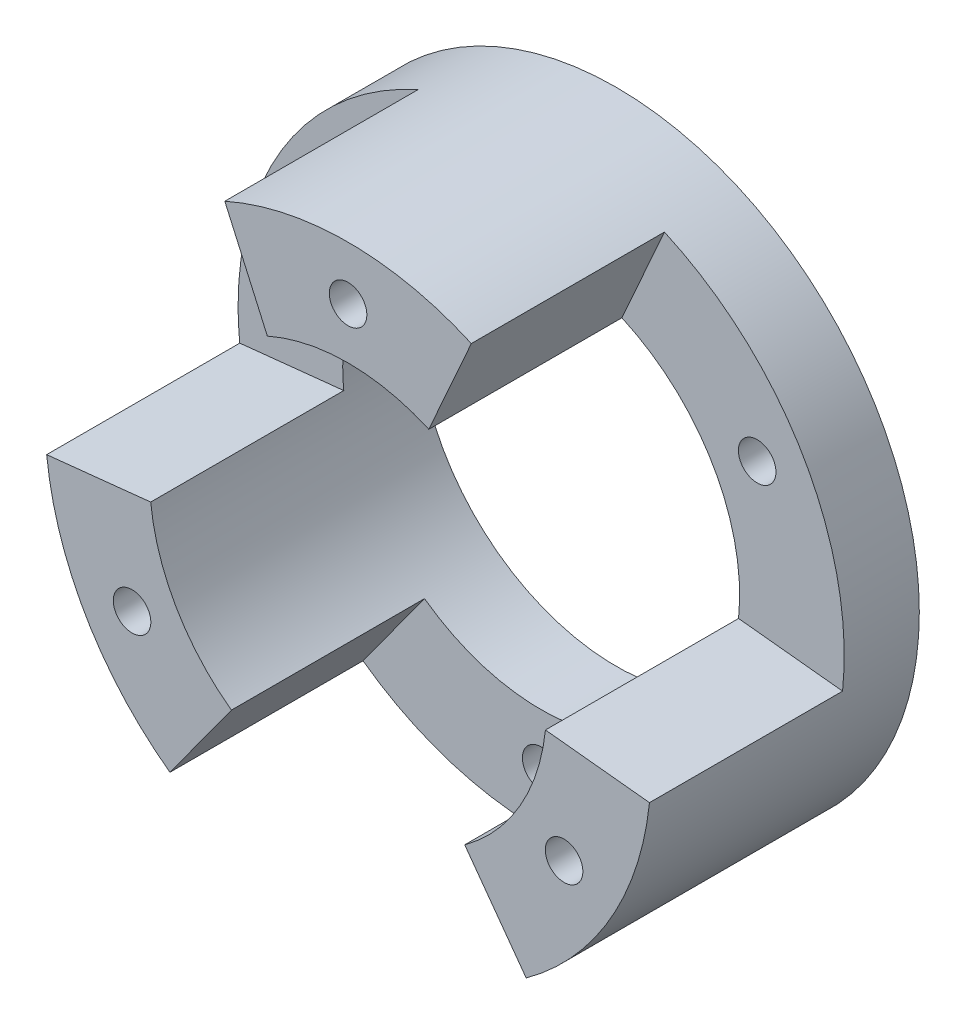
ISO-10303-21;
HEADER;
FILE_DESCRIPTION(('STEP AP214'),'2;1');
FILE_NAME('part.step','',(''),(''),'','','');
FILE_SCHEMA(('AUTOMOTIVE_DESIGN { 1 0 10303 214 1 1 1 1 }'));
ENDSEC;
DATA;
#1=APPLICATION_CONTEXT('core data for automotive mechanical design processes');
#2=APPLICATION_PROTOCOL_DEFINITION('international standard','automotive_design',2000,#1);
#3=PRODUCT_CONTEXT('',#1,'mechanical');
#4=PRODUCT('Part','Part','',(#3));
#5=PRODUCT_RELATED_PRODUCT_CATEGORY('part','',(#4));
#6=PRODUCT_DEFINITION_FORMATION('','',#4);
#7=PRODUCT_DEFINITION_CONTEXT('part definition',#1,'design');
#8=PRODUCT_DEFINITION('design','',#6,#7);
#9=PRODUCT_DEFINITION_SHAPE('','',#8);
#10=(LENGTH_UNIT() NAMED_UNIT(*) SI_UNIT(.MILLI.,.METRE.));
#11=(NAMED_UNIT(*) PLANE_ANGLE_UNIT() SI_UNIT($,.RADIAN.));
#12=(NAMED_UNIT(*) SI_UNIT($,.STERADIAN.) SOLID_ANGLE_UNIT());
#13=UNCERTAINTY_MEASURE_WITH_UNIT(LENGTH_MEASURE(1.E-05),#10,'distance_accuracy_value','');
#14=(GEOMETRIC_REPRESENTATION_CONTEXT(3) GLOBAL_UNCERTAINTY_ASSIGNED_CONTEXT((#13)) GLOBAL_UNIT_ASSIGNED_CONTEXT((#10,
#11,#12)) REPRESENTATION_CONTEXT('',''));
#15=CARTESIAN_POINT('',(0.,0.,0.));
#16=DIRECTION('',(0.,0.,1.));
#17=DIRECTION('',(1.,0.,0.));
#18=AXIS2_PLACEMENT_3D('',#15,#16,#17);
#19=CARTESIAN_POINT('',(0.,28.25,3.));
#20=DIRECTION('',(0.,0.,1.));
#21=DIRECTION('',(1.,0.,0.));
#22=AXIS2_PLACEMENT_3D('',#19,#20,#21);
#23=PLANE('',#22);
#24=CARTESIAN_POINT('',(0.,-23.25,3.));
#25=DIRECTION('',(0.,0.,1.));
#26=DIRECTION('',(1.,0.,0.));
#27=AXIS2_PLACEMENT_3D('',#24,#25,#26);
#28=CIRCLE('',#27,1.75);
#29=CARTESIAN_POINT('',(1.75,-23.25,3.));
#30=VERTEX_POINT('',#29);
#31=EDGE_CURVE('E280',#30,#30,#28,.T.);
#32=ORIENTED_EDGE('',*,*,#31,.F.);
#33=EDGE_LOOP('',(#32));
#34=FACE_BOUND('',#33,.T.);
#35=CARTESIAN_POINT('',(0.,0.,3.));
#36=DIRECTION('',(0.,0.,-1.));
#37=DIRECTION('',(-1.,0.,0.));
#38=AXIS2_PLACEMENT_3D('',#35,#36,#37);
#39=CIRCLE('',#38,18.5);
#40=CARTESIAN_POINT('',(10.8740271674107,-14.9668143959366,3.));
#41=VERTEX_POINT('',#40);
#42=CARTESIAN_POINT('',(-10.8740271674109,-14.9668143959364,3.));
#43=VERTEX_POINT('',#42);
#44=EDGE_CURVE('E210',#41,#43,#39,.T.);
#45=ORIENTED_EDGE('',*,*,#44,.T.);
#46=DIRECTION('',(0.58778525229248,0.809016994374942,0.));
#47=VECTOR('',#46,1.);
#48=CARTESIAN_POINT('',(-10.8740271674109,-14.9668143959364,3.));
#49=LINE('',#48,#47);
#50=CARTESIAN_POINT('',(-16.6049333772626,-22.8547300910921,3.));
#51=VERTEX_POINT('',#50);
#52=EDGE_CURVE('E252',#51,#43,#49,.T.);
#53=ORIENTED_EDGE('',*,*,#52,.F.);
#54=CARTESIAN_POINT('',(0.,0.,3.));
#55=DIRECTION('',(0.,0.,-1.));
#56=DIRECTION('',(-1.,0.,0.));
#57=AXIS2_PLACEMENT_3D('',#54,#55,#56);
#58=CIRCLE('',#57,28.25);
#59=CARTESIAN_POINT('',(16.6049333772622,-22.8547300910924,3.));
#60=VERTEX_POINT('',#59);
#61=EDGE_CURVE('E149',#60,#51,#58,.T.);
#62=ORIENTED_EDGE('',*,*,#61,.F.);
#63=DIRECTION('',(0.587785252292469,-0.809016994374951,0.));
#64=VECTOR('',#63,1.);
#65=CARTESIAN_POINT('',(10.8740271674107,-14.9668143959366,3.));
#66=LINE('',#65,#64);
#67=EDGE_CURVE('E152',#41,#60,#66,.T.);
#68=ORIENTED_EDGE('',*,*,#67,.F.);
#69=EDGE_LOOP('',(#45,#53,#62,#68));
#70=FACE_BOUND('',#69,.T.);
#71=ADVANCED_FACE('F37',(#34,#70),#23,.T.);
#72=CARTESIAN_POINT('',(-20.1350906379881,11.6250000000001,3.));
#73=DIRECTION('',(0.,0.,1.));
#74=DIRECTION('',(-0.500000000000004,-0.866025403784436,0.));
#75=AXIS2_PLACEMENT_3D('',#72,#73,#74);
#76=CIRCLE('',#75,1.75);
#77=CARTESIAN_POINT('',(-21.0100906379882,10.1094555433773,3.));
#78=VERTEX_POINT('',#77);
#79=EDGE_CURVE('E292',#78,#78,#76,.T.);
#80=ORIENTED_EDGE('',*,*,#79,.F.);
#81=EDGE_LOOP('',(#80));
#82=FACE_BOUND('',#81,.T.);
#83=CARTESIAN_POINT('',(-28.0952435441538,-2.95292908731092,3.));
#84=VERTEX_POINT('',#83);
#85=CARTESIAN_POINT('',(-11.4903101668914,25.8076591784035,3.));
#86=VERTEX_POINT('',#85);
#87=EDGE_CURVE('E206',#84,#86,#58,.T.);
#88=ORIENTED_EDGE('',*,*,#87,.F.);
#89=DIRECTION('',(-0.994521895368274,-0.104528463267643,0.));
#90=VECTOR('',#89,1.);
#91=CARTESIAN_POINT('',(-18.3986550643131,-1.9337765704514,3.));
#92=LINE('',#91,#90);
#93=CARTESIAN_POINT('',(-18.3986550643131,-1.9337765704514,3.));
#94=VERTEX_POINT('',#93);
#95=EDGE_CURVE('E143',#94,#84,#92,.T.);
#96=ORIENTED_EDGE('',*,*,#95,.F.);
#97=CARTESIAN_POINT('',(-7.52462789690232,16.9005909663881,3.));
#98=VERTEX_POINT('',#97);
#99=EDGE_CURVE('E208',#94,#98,#39,.T.);
#100=ORIENTED_EDGE('',*,*,#99,.T.);
#101=DIRECTION('',(0.406736643075801,-0.913545457642601,0.));
#102=VECTOR('',#101,1.);
#103=CARTESIAN_POINT('',(-7.52462789690232,16.9005909663881,3.));
#104=LINE('',#103,#102);
#105=EDGE_CURVE('E176',#86,#98,#104,.T.);
#106=ORIENTED_EDGE('',*,*,#105,.F.);
#107=EDGE_LOOP('',(#88,#96,#100,#106));
#108=FACE_BOUND('',#107,.T.);
#109=ADVANCED_FACE('F220',(#82,#108),#23,.T.);
#110=CARTESIAN_POINT('',(20.1350906379883,11.6249999999998,3.));
#111=DIRECTION('',(0.,0.,1.));
#112=DIRECTION('',(-0.499999999999992,0.866025403784443,0.));
#113=AXIS2_PLACEMENT_3D('',#110,#111,#112);
#114=CIRCLE('',#113,1.75);
#115=CARTESIAN_POINT('',(19.2600906379883,13.1405444566226,3.));
#116=VERTEX_POINT('',#115);
#117=EDGE_CURVE('E286',#116,#116,#114,.T.);
#118=ORIENTED_EDGE('',*,*,#117,.F.);
#119=EDGE_LOOP('',(#118));
#120=FACE_BOUND('',#119,.T.);
#121=CARTESIAN_POINT('',(7.52462789690232,16.9005909663881,3.));
#122=VERTEX_POINT('',#121);
#123=CARTESIAN_POINT('',(18.3986550643131,-1.93377657045166,3.));
#124=VERTEX_POINT('',#123);
#125=EDGE_CURVE('E45',#122,#124,#39,.T.);
#126=ORIENTED_EDGE('',*,*,#125,.T.);
#127=DIRECTION('',(-0.994521895368273,0.104528463267657,0.));
#128=VECTOR('',#127,1.);
#129=CARTESIAN_POINT('',(18.3986550643131,-1.93377657045166,3.));
#130=LINE('',#129,#128);
#131=CARTESIAN_POINT('',(28.0952435441537,-2.95292908731132,3.));
#132=VERTEX_POINT('',#131);
#133=EDGE_CURVE('E150',#132,#124,#130,.T.);
#134=ORIENTED_EDGE('',*,*,#133,.F.);
#135=CARTESIAN_POINT('',(11.4903101668914,25.8076591784035,3.));
#136=VERTEX_POINT('',#135);
#137=EDGE_CURVE('E207',#136,#132,#58,.T.);
#138=ORIENTED_EDGE('',*,*,#137,.F.);
#139=DIRECTION('',(0.406736643075801,0.913545457642601,0.));
#140=VECTOR('',#139,1.);
#141=CARTESIAN_POINT('',(7.52462789690232,16.9005909663881,3.));
#142=LINE('',#141,#140);
#143=EDGE_CURVE('E181',#122,#136,#142,.T.);
#144=ORIENTED_EDGE('',*,*,#143,.F.);
#145=EDGE_LOOP('',(#126,#134,#138,#144));
#146=FACE_BOUND('',#145,.T.);
#147=ADVANCED_FACE('F238',(#120,#146),#23,.T.);
#148=CARTESIAN_POINT('',(0.,28.25,-4.));
#149=DIRECTION('',(0.,0.,-1.));
#150=DIRECTION('',(-1.,0.,0.));
#151=AXIS2_PLACEMENT_3D('',#148,#149,#150);
#152=PLANE('',#151);
#153=CARTESIAN_POINT('',(-20.1350906379881,11.6250000000001,-4.));
#154=DIRECTION('',(0.,0.,1.));
#155=DIRECTION('',(-0.500000000000004,-0.866025403784436,0.));
#156=AXIS2_PLACEMENT_3D('',#153,#154,#155);
#157=CIRCLE('',#156,1.75);
#158=CARTESIAN_POINT('',(-21.0100906379882,10.1094555433773,-4.));
#159=VERTEX_POINT('',#158);
#160=EDGE_CURVE('E283',#159,#159,#157,.T.);
#161=ORIENTED_EDGE('',*,*,#160,.T.);
#162=EDGE_LOOP('',(#161));
#163=FACE_BOUND('',#162,.T.);
#164=CARTESIAN_POINT('',(20.1350906379883,11.6249999999998,-4.));
#165=DIRECTION('',(0.,0.,1.));
#166=DIRECTION('',(-0.499999999999992,0.866025403784443,0.));
#167=AXIS2_PLACEMENT_3D('',#164,#165,#166);
#168=CIRCLE('',#167,1.75);
#169=CARTESIAN_POINT('',(19.2600906379883,13.1405444566226,-4.));
#170=VERTEX_POINT('',#169);
#171=EDGE_CURVE('E289',#170,#170,#168,.T.);
#172=ORIENTED_EDGE('',*,*,#171,.T.);
#173=EDGE_LOOP('',(#172));
#174=FACE_BOUND('',#173,.T.);
#175=CARTESIAN_POINT('',(0.,-23.25,-4.));
#176=DIRECTION('',(0.,0.,1.));
#177=DIRECTION('',(1.,0.,0.));
#178=AXIS2_PLACEMENT_3D('',#175,#176,#177);
#179=CIRCLE('',#178,1.75);
#180=CARTESIAN_POINT('',(1.75,-23.25,-4.));
#181=VERTEX_POINT('',#180);
#182=EDGE_CURVE('E272',#181,#181,#179,.T.);
#183=ORIENTED_EDGE('',*,*,#182,.T.);
#184=EDGE_LOOP('',(#183));
#185=FACE_BOUND('',#184,.T.);
#186=CARTESIAN_POINT('',(0.,0.,-4.));
#187=DIRECTION('',(0.,0.,-1.));
#188=DIRECTION('',(-1.,0.,0.));
#189=AXIS2_PLACEMENT_3D('',#186,#187,#188);
#190=CIRCLE('',#189,28.25);
#191=CARTESIAN_POINT('',(-28.25,0.,-4.));
#192=VERTEX_POINT('',#191);
#193=EDGE_CURVE('E203',#192,#192,#190,.T.);
#194=ORIENTED_EDGE('',*,*,#193,.T.);
#195=EDGE_LOOP('',(#194));
#196=FACE_BOUND('',#195,.T.);
#197=CARTESIAN_POINT('',(0.,0.,-4.));
#198=DIRECTION('',(0.,0.,-1.));
#199=DIRECTION('',(-1.,0.,0.));
#200=AXIS2_PLACEMENT_3D('',#197,#198,#199);
#201=CIRCLE('',#200,18.5);
#202=CARTESIAN_POINT('',(-18.5,0.,-4.));
#203=VERTEX_POINT('',#202);
#204=EDGE_CURVE('E11',#203,#203,#201,.T.);
#205=ORIENTED_EDGE('',*,*,#204,.F.);
#206=EDGE_LOOP('',(#205));
#207=FACE_BOUND('',#206,.T.);
#208=ADVANCED_FACE('F39',(#163,#174,#185,#196,#207),#152,.T.);
#209=CARTESIAN_POINT('',(0.,0.,0.));
#210=DIRECTION('',(0.,0.,-1.));
#211=DIRECTION('',(-1.,0.,0.));
#212=AXIS2_PLACEMENT_3D('',#209,#210,#211);
#213=CYLINDRICAL_SURFACE('',#212,18.5);
#214=ORIENTED_EDGE('',*,*,#204,.T.);
#215=EDGE_LOOP('',(#214));
#216=FACE_BOUND('',#215,.T.);
#217=ORIENTED_EDGE('',*,*,#125,.F.);
#218=DIRECTION('',(0.,0.,-1.));
#219=VECTOR('',#218,1.);
#220=CARTESIAN_POINT('',(7.52462789690232,16.9005909663881,21.));
#221=LINE('',#220,#219);
#222=CARTESIAN_POINT('',(7.52462789690232,16.9005909663881,21.));
#223=VERTEX_POINT('',#222);
#224=EDGE_CURVE('E194',#223,#122,#221,.T.);
#225=ORIENTED_EDGE('',*,*,#224,.F.);
#226=CARTESIAN_POINT('',(0.,0.,21.));
#227=DIRECTION('',(0.,0.,-1.));
#228=DIRECTION('',(1.,0.,0.));
#229=AXIS2_PLACEMENT_3D('',#226,#227,#228);
#230=CIRCLE('',#229,18.5);
#231=CARTESIAN_POINT('',(-7.52462789690232,16.9005909663881,21.));
#232=VERTEX_POINT('',#231);
#233=EDGE_CURVE('E183',#232,#223,#230,.T.);
#234=ORIENTED_EDGE('',*,*,#233,.F.);
#235=DIRECTION('',(0.,0.,-1.));
#236=VECTOR('',#235,1.);
#237=CARTESIAN_POINT('',(-7.52462789690232,16.9005909663881,21.));
#238=LINE('',#237,#236);
#239=EDGE_CURVE('E197',#232,#98,#238,.T.);
#240=ORIENTED_EDGE('',*,*,#239,.T.);
#241=ORIENTED_EDGE('',*,*,#99,.F.);
#242=DIRECTION('',(0.,0.,-1.));
#243=VECTOR('',#242,1.);
#244=CARTESIAN_POINT('',(-18.3986550643131,-1.9337765704514,21.));
#245=LINE('',#244,#243);
#246=CARTESIAN_POINT('',(-18.3986550643131,-1.9337765704514,21.));
#247=VERTEX_POINT('',#246);
#248=EDGE_CURVE('E154',#247,#94,#245,.T.);
#249=ORIENTED_EDGE('',*,*,#248,.F.);
#250=CARTESIAN_POINT('',(0.,0.,21.));
#251=DIRECTION('',(0.,0.,-1.));
#252=DIRECTION('',(-0.499999999999992,0.866025403784443,0.));
#253=AXIS2_PLACEMENT_3D('',#250,#251,#252);
#254=CIRCLE('',#253,18.5);
#255=CARTESIAN_POINT('',(-10.8740271674109,-14.9668143959364,21.));
#256=VERTEX_POINT('',#255);
#257=EDGE_CURVE('E137',#256,#247,#254,.T.);
#258=ORIENTED_EDGE('',*,*,#257,.F.);
#259=DIRECTION('',(0.,0.,-1.));
#260=VECTOR('',#259,1.);
#261=CARTESIAN_POINT('',(-10.8740271674109,-14.9668143959364,21.));
#262=LINE('',#261,#260);
#263=EDGE_CURVE('E134',#256,#43,#262,.T.);
#264=ORIENTED_EDGE('',*,*,#263,.T.);
#265=ORIENTED_EDGE('',*,*,#44,.F.);
#266=DIRECTION('',(0.,0.,-1.));
#267=VECTOR('',#266,1.);
#268=CARTESIAN_POINT('',(10.8740271674107,-14.9668143959366,21.));
#269=LINE('',#268,#267);
#270=CARTESIAN_POINT('',(10.8740271674107,-14.9668143959366,21.));
#271=VERTEX_POINT('',#270);
#272=EDGE_CURVE('E169',#271,#41,#269,.T.);
#273=ORIENTED_EDGE('',*,*,#272,.F.);
#274=CARTESIAN_POINT('',(0.,0.,21.));
#275=DIRECTION('',(0.,0.,-1.));
#276=DIRECTION('',(-0.500000000000004,-0.866025403784436,0.));
#277=AXIS2_PLACEMENT_3D('',#274,#275,#276);
#278=CIRCLE('',#277,18.5);
#279=CARTESIAN_POINT('',(18.3986550643131,-1.93377657045166,21.));
#280=VERTEX_POINT('',#279);
#281=EDGE_CURVE('E163',#280,#271,#278,.T.);
#282=ORIENTED_EDGE('',*,*,#281,.F.);
#283=DIRECTION('',(0.,0.,-1.));
#284=VECTOR('',#283,1.);
#285=CARTESIAN_POINT('',(18.3986550643131,-1.93377657045166,21.));
#286=LINE('',#285,#284);
#287=EDGE_CURVE('E171',#280,#124,#286,.T.);
#288=ORIENTED_EDGE('',*,*,#287,.T.);
#289=EDGE_LOOP('',(#217,#225,#234,#240,#241,#249,#258,#264,#265,#273,#282,#288));
#290=FACE_BOUND('',#289,.T.);
#291=ADVANCED_FACE('F228',(#216,#290),#213,.F.);
#292=CARTESIAN_POINT('',(0.,0.,0.));
#293=DIRECTION('',(0.,0.,-1.));
#294=DIRECTION('',(-1.,0.,0.));
#295=AXIS2_PLACEMENT_3D('',#292,#293,#294);
#296=CYLINDRICAL_SURFACE('',#295,28.25);
#297=ORIENTED_EDGE('',*,*,#137,.T.);
#298=DIRECTION('',(0.,0.,-1.));
#299=VECTOR('',#298,1.);
#300=CARTESIAN_POINT('',(28.0952435441537,-2.95292908731132,21.));
#301=LINE('',#300,#299);
#302=CARTESIAN_POINT('',(28.0952435441537,-2.95292908731132,21.));
#303=VERTEX_POINT('',#302);
#304=EDGE_CURVE('E174',#303,#132,#301,.T.);
#305=ORIENTED_EDGE('',*,*,#304,.F.);
#306=CARTESIAN_POINT('',(0.,0.,21.));
#307=DIRECTION('',(0.,0.,1.));
#308=DIRECTION('',(-0.500000000000004,-0.866025403784436,0.));
#309=AXIS2_PLACEMENT_3D('',#306,#307,#308);
#310=CIRCLE('',#309,28.25);
#311=CARTESIAN_POINT('',(16.6049333772622,-22.8547300910924,21.));
#312=VERTEX_POINT('',#311);
#313=EDGE_CURVE('E158',#312,#303,#310,.T.);
#314=ORIENTED_EDGE('',*,*,#313,.F.);
#315=DIRECTION('',(0.,0.,-1.));
#316=VECTOR('',#315,1.);
#317=CARTESIAN_POINT('',(16.6049333772622,-22.8547300910924,21.));
#318=LINE('',#317,#316);
#319=EDGE_CURVE('E59',#312,#60,#318,.T.);
#320=ORIENTED_EDGE('',*,*,#319,.T.);
#321=ORIENTED_EDGE('',*,*,#61,.T.);
#322=DIRECTION('',(0.,0.,-1.));
#323=VECTOR('',#322,1.);
#324=CARTESIAN_POINT('',(-16.6049333772626,-22.8547300910921,21.));
#325=LINE('',#324,#323);
#326=CARTESIAN_POINT('',(-16.6049333772626,-22.8547300910921,21.));
#327=VERTEX_POINT('',#326);
#328=EDGE_CURVE('E131',#327,#51,#325,.T.);
#329=ORIENTED_EDGE('',*,*,#328,.F.);
#330=CARTESIAN_POINT('',(0.,0.,21.));
#331=DIRECTION('',(0.,0.,1.));
#332=DIRECTION('',(-0.499999999999992,0.866025403784443,0.));
#333=AXIS2_PLACEMENT_3D('',#330,#331,#332);
#334=CIRCLE('',#333,28.25);
#335=CARTESIAN_POINT('',(-28.0952435441538,-2.95292908731092,21.));
#336=VERTEX_POINT('',#335);
#337=EDGE_CURVE('E138',#336,#327,#334,.T.);
#338=ORIENTED_EDGE('',*,*,#337,.F.);
#339=DIRECTION('',(0.,0.,-1.));
#340=VECTOR('',#339,1.);
#341=CARTESIAN_POINT('',(-28.0952435441538,-2.95292908731092,21.));
#342=LINE('',#341,#340);
#343=EDGE_CURVE('E52',#336,#84,#342,.T.);
#344=ORIENTED_EDGE('',*,*,#343,.T.);
#345=ORIENTED_EDGE('',*,*,#87,.T.);
#346=DIRECTION('',(0.,0.,-1.));
#347=VECTOR('',#346,1.);
#348=CARTESIAN_POINT('',(-11.4903101668914,25.8076591784035,21.));
#349=LINE('',#348,#347);
#350=CARTESIAN_POINT('',(-11.4903101668914,25.8076591784035,21.));
#351=VERTEX_POINT('',#350);
#352=EDGE_CURVE('E200',#351,#86,#349,.T.);
#353=ORIENTED_EDGE('',*,*,#352,.F.);
#354=CARTESIAN_POINT('',(0.,0.,21.));
#355=DIRECTION('',(0.,0.,1.));
#356=DIRECTION('',(1.,0.,0.));
#357=AXIS2_PLACEMENT_3D('',#354,#355,#356);
#358=CIRCLE('',#357,28.25);
#359=CARTESIAN_POINT('',(11.4903101668914,25.8076591784035,21.));
#360=VERTEX_POINT('',#359);
#361=EDGE_CURVE('E177',#360,#351,#358,.T.);
#362=ORIENTED_EDGE('',*,*,#361,.F.);
#363=DIRECTION('',(0.,0.,-1.));
#364=VECTOR('',#363,1.);
#365=CARTESIAN_POINT('',(11.4903101668914,25.8076591784035,21.));
#366=LINE('',#365,#364);
#367=EDGE_CURVE('E187',#360,#136,#366,.T.);
#368=ORIENTED_EDGE('',*,*,#367,.T.);
#369=EDGE_LOOP('',(#297,#305,#314,#320,#321,#329,#338,#344,#345,#353,#362,#368));
#370=FACE_BOUND('',#369,.T.);
#371=ORIENTED_EDGE('',*,*,#193,.F.);
#372=EDGE_LOOP('',(#371));
#373=FACE_BOUND('',#372,.T.);
#374=ADVANCED_FACE('F146',(#370,#373),#296,.T.);
#375=CARTESIAN_POINT('',(-7.52462789690232,16.9005909663881,21.));
#376=DIRECTION('',(0.913545457642601,0.406736643075801,0.));
#377=DIRECTION('',(-0.406736643075801,0.913545457642601,0.));
#378=AXIS2_PLACEMENT_3D('',#375,#376,#377);
#379=PLANE('',#378);
#380=ORIENTED_EDGE('',*,*,#105,.T.);
#381=ORIENTED_EDGE('',*,*,#239,.F.);
#382=DIRECTION('',(0.406736643075801,-0.913545457642601,0.));
#383=VECTOR('',#382,1.);
#384=CARTESIAN_POINT('',(-7.52462789690232,16.9005909663881,21.));
#385=LINE('',#384,#383);
#386=EDGE_CURVE('E180',#351,#232,#385,.T.);
#387=ORIENTED_EDGE('',*,*,#386,.F.);
#388=ORIENTED_EDGE('',*,*,#352,.T.);
#389=EDGE_LOOP('',(#380,#381,#387,#388));
#390=FACE_BOUND('',#389,.T.);
#391=ADVANCED_FACE('F225',(#390),#379,.F.);
#392=CARTESIAN_POINT('',(7.52462789690232,16.9005909663881,21.));
#393=DIRECTION('',(-0.913545457642601,0.406736643075801,0.));
#394=DIRECTION('',(-0.406736643075801,-0.913545457642601,0.));
#395=AXIS2_PLACEMENT_3D('',#392,#393,#394);
#396=PLANE('',#395);
#397=ORIENTED_EDGE('',*,*,#143,.T.);
#398=ORIENTED_EDGE('',*,*,#367,.F.);
#399=DIRECTION('',(0.406736643075801,0.913545457642601,0.));
#400=VECTOR('',#399,1.);
#401=CARTESIAN_POINT('',(7.52462789690232,16.9005909663881,21.));
#402=LINE('',#401,#400);
#403=EDGE_CURVE('E185',#223,#360,#402,.T.);
#404=ORIENTED_EDGE('',*,*,#403,.F.);
#405=ORIENTED_EDGE('',*,*,#224,.T.);
#406=EDGE_LOOP('',(#397,#398,#404,#405));
#407=FACE_BOUND('',#406,.T.);
#408=ADVANCED_FACE('F237',(#407),#396,.F.);
#409=CARTESIAN_POINT('',(0.,0.,21.));
#410=DIRECTION('',(0.,0.,1.));
#411=DIRECTION('',(1.,0.,0.));
#412=AXIS2_PLACEMENT_3D('',#409,#410,#411);
#413=PLANE('',#412);
#414=CARTESIAN_POINT('',(0.,23.25,21.));
#415=DIRECTION('',(0.,0.,1.));
#416=DIRECTION('',(1.,0.,0.));
#417=AXIS2_PLACEMENT_3D('',#414,#415,#416);
#418=CIRCLE('',#417,1.75);
#419=CARTESIAN_POINT('',(1.75,23.25,21.));
#420=VERTEX_POINT('',#419);
#421=EDGE_CURVE('E257',#420,#420,#418,.T.);
#422=ORIENTED_EDGE('',*,*,#421,.F.);
#423=EDGE_LOOP('',(#422));
#424=FACE_BOUND('',#423,.T.);
#425=ORIENTED_EDGE('',*,*,#361,.T.);
#426=ORIENTED_EDGE('',*,*,#386,.T.);
#427=ORIENTED_EDGE('',*,*,#233,.T.);
#428=ORIENTED_EDGE('',*,*,#403,.T.);
#429=EDGE_LOOP('',(#425,#426,#427,#428));
#430=FACE_BOUND('',#429,.T.);
#431=ADVANCED_FACE('F232',(#424,#430),#413,.T.);
#432=CARTESIAN_POINT('',(18.3986550643131,-1.93377657045166,21.));
#433=DIRECTION('',(-0.104528463267657,-0.994521895368273,0.));
#434=DIRECTION('',(0.994521895368273,-0.104528463267657,0.));
#435=AXIS2_PLACEMENT_3D('',#432,#433,#434);
#436=PLANE('',#435);
#437=ORIENTED_EDGE('',*,*,#133,.T.);
#438=ORIENTED_EDGE('',*,*,#287,.F.);
#439=DIRECTION('',(-0.994521895368273,0.104528463267657,0.));
#440=VECTOR('',#439,1.);
#441=CARTESIAN_POINT('',(18.3986550643131,-1.93377657045166,21.));
#442=LINE('',#441,#440);
#443=EDGE_CURVE('E161',#303,#280,#442,.T.);
#444=ORIENTED_EDGE('',*,*,#443,.F.);
#445=ORIENTED_EDGE('',*,*,#304,.T.);
#446=EDGE_LOOP('',(#437,#438,#444,#445));
#447=FACE_BOUND('',#446,.T.);
#448=ADVANCED_FACE('F243',(#447),#436,.F.);
#449=CARTESIAN_POINT('',(10.8740271674107,-14.9668143959366,21.));
#450=DIRECTION('',(0.809016994374951,0.587785252292469,0.));
#451=DIRECTION('',(-0.587785252292469,0.809016994374951,0.));
#452=AXIS2_PLACEMENT_3D('',#449,#450,#451);
#453=PLANE('',#452);
#454=ORIENTED_EDGE('',*,*,#67,.T.);
#455=ORIENTED_EDGE('',*,*,#319,.F.);
#456=DIRECTION('',(0.587785252292469,-0.809016994374951,0.));
#457=VECTOR('',#456,1.);
#458=CARTESIAN_POINT('',(10.8740271674107,-14.9668143959366,21.));
#459=LINE('',#458,#457);
#460=EDGE_CURVE('E165',#271,#312,#459,.T.);
#461=ORIENTED_EDGE('',*,*,#460,.F.);
#462=ORIENTED_EDGE('',*,*,#272,.T.);
#463=EDGE_LOOP('',(#454,#455,#461,#462));
#464=FACE_BOUND('',#463,.T.);
#465=ADVANCED_FACE('F248',(#464),#453,.F.);
#466=CARTESIAN_POINT('',(0.,0.,21.));
#467=DIRECTION('',(0.,0.,1.));
#468=DIRECTION('',(-0.500000000000004,-0.866025403784436,0.));
#469=AXIS2_PLACEMENT_3D('',#466,#467,#468);
#470=PLANE('',#469);
#471=CARTESIAN_POINT('',(20.1350906379881,-11.6250000000001,21.));
#472=DIRECTION('',(0.,0.,1.));
#473=DIRECTION('',(-0.500000000000004,-0.866025403784436,0.));
#474=AXIS2_PLACEMENT_3D('',#471,#472,#473);
#475=CIRCLE('',#474,1.75);
#476=CARTESIAN_POINT('',(19.2600906379881,-13.1405444566229,21.));
#477=VERTEX_POINT('',#476);
#478=EDGE_CURVE('E275',#477,#477,#475,.T.);
#479=ORIENTED_EDGE('',*,*,#478,.F.);
#480=EDGE_LOOP('',(#479));
#481=FACE_BOUND('',#480,.T.);
#482=ORIENTED_EDGE('',*,*,#313,.T.);
#483=ORIENTED_EDGE('',*,*,#443,.T.);
#484=ORIENTED_EDGE('',*,*,#281,.T.);
#485=ORIENTED_EDGE('',*,*,#460,.T.);
#486=EDGE_LOOP('',(#482,#483,#484,#485));
#487=FACE_BOUND('',#486,.T.);
#488=ADVANCED_FACE('F245',(#481,#487),#470,.T.);
#489=CARTESIAN_POINT('',(-10.8740271674109,-14.9668143959364,21.));
#490=DIRECTION('',(-0.809016994374943,0.58778525229248,0.));
#491=DIRECTION('',(-0.58778525229248,-0.809016994374943,0.));
#492=AXIS2_PLACEMENT_3D('',#489,#490,#491);
#493=PLANE('',#492);
#494=ORIENTED_EDGE('',*,*,#52,.T.);
#495=ORIENTED_EDGE('',*,*,#263,.F.);
#496=DIRECTION('',(0.58778525229248,0.809016994374942,0.));
#497=VECTOR('',#496,1.);
#498=CARTESIAN_POINT('',(-10.8740271674109,-14.9668143959364,21.));
#499=LINE('',#498,#497);
#500=EDGE_CURVE('E127',#327,#256,#499,.T.);
#501=ORIENTED_EDGE('',*,*,#500,.F.);
#502=ORIENTED_EDGE('',*,*,#328,.T.);
#503=EDGE_LOOP('',(#494,#495,#501,#502));
#504=FACE_BOUND('',#503,.T.);
#505=ADVANCED_FACE('F129',(#504),#493,.F.);
#506=CARTESIAN_POINT('',(-18.3986550643131,-1.9337765704514,21.));
#507=DIRECTION('',(0.104528463267643,-0.994521895368274,0.));
#508=DIRECTION('',(0.994521895368275,0.104528463267643,0.));
#509=AXIS2_PLACEMENT_3D('',#506,#507,#508);
#510=PLANE('',#509);
#511=ORIENTED_EDGE('',*,*,#95,.T.);
#512=ORIENTED_EDGE('',*,*,#343,.F.);
#513=DIRECTION('',(-0.994521895368274,-0.104528463267643,0.));
#514=VECTOR('',#513,1.);
#515=CARTESIAN_POINT('',(-18.3986550643131,-1.9337765704514,21.));
#516=LINE('',#515,#514);
#517=EDGE_CURVE('E142',#247,#336,#516,.T.);
#518=ORIENTED_EDGE('',*,*,#517,.F.);
#519=ORIENTED_EDGE('',*,*,#248,.T.);
#520=EDGE_LOOP('',(#511,#512,#518,#519));
#521=FACE_BOUND('',#520,.T.);
#522=ADVANCED_FACE('F263',(#521),#510,.F.);
#523=CARTESIAN_POINT('',(0.,0.,21.));
#524=DIRECTION('',(0.,0.,1.));
#525=DIRECTION('',(-0.499999999999992,0.866025403784443,0.));
#526=AXIS2_PLACEMENT_3D('',#523,#524,#525);
#527=PLANE('',#526);
#528=CARTESIAN_POINT('',(-20.1350906379883,-11.6249999999998,21.));
#529=DIRECTION('',(0.,0.,1.));
#530=DIRECTION('',(-0.499999999999992,0.866025403784443,0.));
#531=AXIS2_PLACEMENT_3D('',#528,#529,#530);
#532=CIRCLE('',#531,1.75);
#533=CARTESIAN_POINT('',(-21.0100906379883,-10.109455543377,21.));
#534=VERTEX_POINT('',#533);
#535=EDGE_CURVE('E268',#534,#534,#532,.T.);
#536=ORIENTED_EDGE('',*,*,#535,.F.);
#537=EDGE_LOOP('',(#536));
#538=FACE_BOUND('',#537,.T.);
#539=ORIENTED_EDGE('',*,*,#337,.T.);
#540=ORIENTED_EDGE('',*,*,#500,.T.);
#541=ORIENTED_EDGE('',*,*,#257,.T.);
#542=ORIENTED_EDGE('',*,*,#517,.T.);
#543=EDGE_LOOP('',(#539,#540,#541,#542));
#544=FACE_BOUND('',#543,.T.);
#545=ADVANCED_FACE('F140',(#538,#544),#527,.T.);
#546=CARTESIAN_POINT('',(0.,23.25,9.));
#547=DIRECTION('',(0.,0.,1.));
#548=DIRECTION('',(1.,0.,0.));
#549=AXIS2_PLACEMENT_3D('',#546,#547,#548);
#550=CYLINDRICAL_SURFACE('',#549,1.75);
#551=CARTESIAN_POINT('',(0.,23.25,9.));
#552=DIRECTION('',(0.,0.,1.));
#553=DIRECTION('',(1.,0.,0.));
#554=AXIS2_PLACEMENT_3D('',#551,#552,#553);
#555=CIRCLE('',#554,1.75);
#556=CARTESIAN_POINT('',(1.75,23.25,9.));
#557=VERTEX_POINT('',#556);
#558=EDGE_CURVE('E253',#557,#557,#555,.T.);
#559=ORIENTED_EDGE('',*,*,#558,.F.);
#560=EDGE_LOOP('',(#559));
#561=FACE_BOUND('',#560,.T.);
#562=ORIENTED_EDGE('',*,*,#421,.T.);
#563=EDGE_LOOP('',(#562));
#564=FACE_BOUND('',#563,.T.);
#565=ADVANCED_FACE('F415',(#561,#564),#550,.F.);
#566=CARTESIAN_POINT('',(0.,23.25,9.));
#567=DIRECTION('',(0.,0.,1.));
#568=DIRECTION('',(1.,0.,0.));
#569=AXIS2_PLACEMENT_3D('',#566,#567,#568);
#570=PLANE('',#569);
#571=ORIENTED_EDGE('',*,*,#558,.T.);
#572=EDGE_LOOP('',(#571));
#573=FACE_BOUND('',#572,.T.);
#574=ADVANCED_FACE('F402',(#573),#570,.T.);
#575=CARTESIAN_POINT('',(-20.1350906379883,-11.6249999999998,9.));
#576=DIRECTION('',(0.,0.,1.));
#577=DIRECTION('',(1.,0.,0.));
#578=AXIS2_PLACEMENT_3D('',#575,#576,#577);
#579=CYLINDRICAL_SURFACE('',#578,1.75);
#580=CARTESIAN_POINT('',(-20.1350906379883,-11.6249999999998,9.));
#581=DIRECTION('',(0.,0.,1.));
#582=DIRECTION('',(-0.499999999999992,0.866025403784443,0.));
#583=AXIS2_PLACEMENT_3D('',#580,#581,#582);
#584=CIRCLE('',#583,1.75);
#585=CARTESIAN_POINT('',(-21.0100906379883,-10.109455543377,9.));
#586=VERTEX_POINT('',#585);
#587=EDGE_CURVE('E271',#586,#586,#584,.T.);
#588=ORIENTED_EDGE('',*,*,#587,.F.);
#589=EDGE_LOOP('',(#588));
#590=FACE_BOUND('',#589,.T.);
#591=ORIENTED_EDGE('',*,*,#535,.T.);
#592=EDGE_LOOP('',(#591));
#593=FACE_BOUND('',#592,.T.);
#594=ADVANCED_FACE('F391',(#590,#593),#579,.F.);
#595=CARTESIAN_POINT('',(-20.1350906379883,-11.6249999999998,9.));
#596=DIRECTION('',(0.,0.,1.));
#597=DIRECTION('',(-0.499999999999992,0.866025403784443,0.));
#598=AXIS2_PLACEMENT_3D('',#595,#596,#597);
#599=PLANE('',#598);
#600=ORIENTED_EDGE('',*,*,#587,.T.);
#601=EDGE_LOOP('',(#600));
#602=FACE_BOUND('',#601,.T.);
#603=ADVANCED_FACE('F380',(#602),#599,.T.);
#604=CARTESIAN_POINT('',(20.1350906379881,-11.6250000000001,9.));
#605=DIRECTION('',(0.,0.,1.));
#606=DIRECTION('',(1.,0.,0.));
#607=AXIS2_PLACEMENT_3D('',#604,#605,#606);
#608=CYLINDRICAL_SURFACE('',#607,1.75);
#609=CARTESIAN_POINT('',(20.1350906379881,-11.6250000000001,9.));
#610=DIRECTION('',(0.,0.,1.));
#611=DIRECTION('',(-0.500000000000004,-0.866025403784436,0.));
#612=AXIS2_PLACEMENT_3D('',#609,#610,#611);
#613=CIRCLE('',#612,1.75);
#614=CARTESIAN_POINT('',(19.2600906379881,-13.1405444566229,9.));
#615=VERTEX_POINT('',#614);
#616=EDGE_CURVE('E266',#615,#615,#613,.T.);
#617=ORIENTED_EDGE('',*,*,#616,.F.);
#618=EDGE_LOOP('',(#617));
#619=FACE_BOUND('',#618,.T.);
#620=ORIENTED_EDGE('',*,*,#478,.T.);
#621=EDGE_LOOP('',(#620));
#622=FACE_BOUND('',#621,.T.);
#623=ADVANCED_FACE('F369',(#619,#622),#608,.F.);
#624=CARTESIAN_POINT('',(20.1350906379881,-11.6250000000001,9.));
#625=DIRECTION('',(0.,0.,1.));
#626=DIRECTION('',(-0.500000000000004,-0.866025403784436,0.));
#627=AXIS2_PLACEMENT_3D('',#624,#625,#626);
#628=PLANE('',#627);
#629=ORIENTED_EDGE('',*,*,#616,.T.);
#630=EDGE_LOOP('',(#629));
#631=FACE_BOUND('',#630,.T.);
#632=ADVANCED_FACE('F349',(#631),#628,.T.);
#633=CARTESIAN_POINT('',(0.,-23.25,-4.));
#634=DIRECTION('',(0.,0.,1.));
#635=DIRECTION('',(1.,0.,0.));
#636=AXIS2_PLACEMENT_3D('',#633,#634,#635);
#637=CYLINDRICAL_SURFACE('',#636,1.75);
#638=ORIENTED_EDGE('',*,*,#182,.F.);
#639=EDGE_LOOP('',(#638));
#640=FACE_BOUND('',#639,.T.);
#641=ORIENTED_EDGE('',*,*,#31,.T.);
#642=EDGE_LOOP('',(#641));
#643=FACE_BOUND('',#642,.T.);
#644=ADVANCED_FACE('F344',(#640,#643),#637,.F.);
#645=CARTESIAN_POINT('',(20.1350906379883,11.6249999999998,-4.));
#646=DIRECTION('',(0.,0.,1.));
#647=DIRECTION('',(1.,0.,0.));
#648=AXIS2_PLACEMENT_3D('',#645,#646,#647);
#649=CYLINDRICAL_SURFACE('',#648,1.75);
#650=ORIENTED_EDGE('',*,*,#171,.F.);
#651=EDGE_LOOP('',(#650));
#652=FACE_BOUND('',#651,.T.);
#653=ORIENTED_EDGE('',*,*,#117,.T.);
#654=EDGE_LOOP('',(#653));
#655=FACE_BOUND('',#654,.T.);
#656=ADVANCED_FACE('F303',(#652,#655),#649,.F.);
#657=CARTESIAN_POINT('',(-20.1350906379881,11.6250000000001,-4.));
#658=DIRECTION('',(0.,0.,1.));
#659=DIRECTION('',(1.,0.,0.));
#660=AXIS2_PLACEMENT_3D('',#657,#658,#659);
#661=CYLINDRICAL_SURFACE('',#660,1.75);
#662=ORIENTED_EDGE('',*,*,#160,.F.);
#663=EDGE_LOOP('',(#662));
#664=FACE_BOUND('',#663,.T.);
#665=ORIENTED_EDGE('',*,*,#79,.T.);
#666=EDGE_LOOP('',(#665));
#667=FACE_BOUND('',#666,.T.);
#668=ADVANCED_FACE('F300',(#664,#667),#661,.F.);
#669=CLOSED_SHELL('',(#71,#109,#147,#208,#291,#374,#391,#408,#431,#448,#465,#488,#505,#522,#545,
#565,#574,#594,#603,#623,#632,#644,#656,#668));
#670=MANIFOLD_SOLID_BREP('B2',#669);
#671=ADVANCED_BREP_SHAPE_REPRESENTATION('',(#18,#670),#14);
#672=SHAPE_DEFINITION_REPRESENTATION(#9,#671);
ENDSEC;
END-ISO-10303-21;
